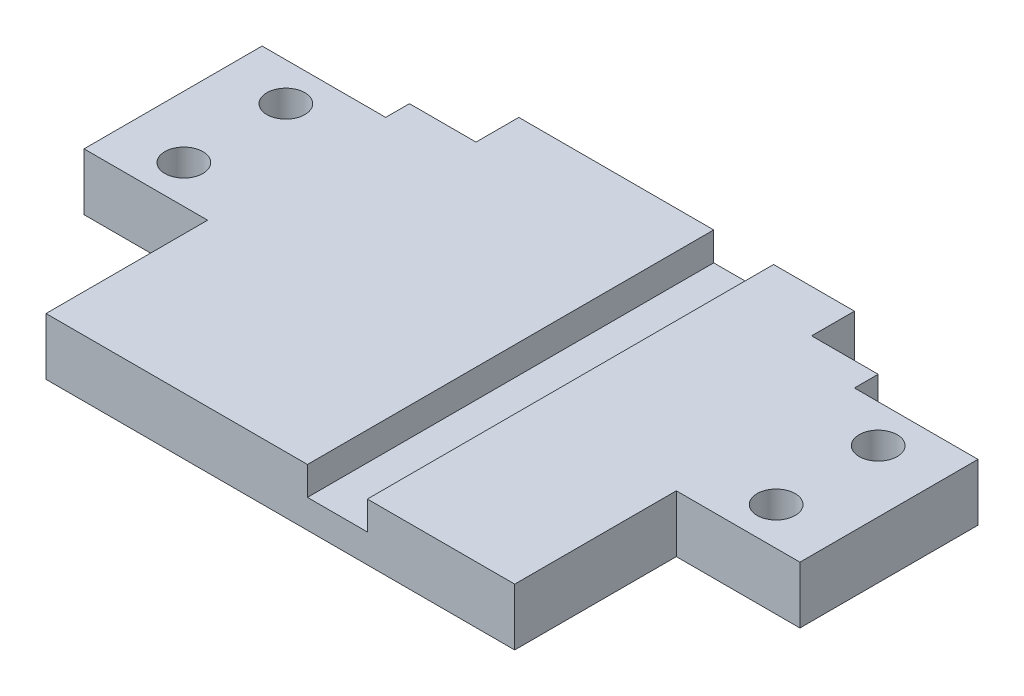
ISO-10303-21;
HEADER;
FILE_DESCRIPTION(('STEP AP214'),'2;1');
FILE_NAME('part.step','',(''),(''),'','','');
FILE_SCHEMA(('AUTOMOTIVE_DESIGN { 1 0 10303 214 1 1 1 1 }'));
ENDSEC;
DATA;
#1=APPLICATION_CONTEXT('core data for automotive mechanical design processes');
#2=APPLICATION_PROTOCOL_DEFINITION('international standard','automotive_design',2000,#1);
#3=PRODUCT_CONTEXT('',#1,'mechanical');
#4=PRODUCT('Part','Part','',(#3));
#5=PRODUCT_RELATED_PRODUCT_CATEGORY('part','',(#4));
#6=PRODUCT_DEFINITION_FORMATION('','',#4);
#7=PRODUCT_DEFINITION_CONTEXT('part definition',#1,'design');
#8=PRODUCT_DEFINITION('design','',#6,#7);
#9=PRODUCT_DEFINITION_SHAPE('','',#8);
#10=(LENGTH_UNIT() NAMED_UNIT(*) SI_UNIT(.MILLI.,.METRE.));
#11=(NAMED_UNIT(*) PLANE_ANGLE_UNIT() SI_UNIT($,.RADIAN.));
#12=(NAMED_UNIT(*) SI_UNIT($,.STERADIAN.) SOLID_ANGLE_UNIT());
#13=UNCERTAINTY_MEASURE_WITH_UNIT(LENGTH_MEASURE(1.E-05),#10,'distance_accuracy_value','');
#14=(GEOMETRIC_REPRESENTATION_CONTEXT(3) GLOBAL_UNCERTAINTY_ASSIGNED_CONTEXT((#13)) GLOBAL_UNIT_ASSIGNED_CONTEXT((#10,
#11,#12)) REPRESENTATION_CONTEXT('',''));
#15=CARTESIAN_POINT('',(0.,0.,0.));
#16=DIRECTION('',(0.,0.,1.));
#17=DIRECTION('',(1.,0.,0.));
#18=AXIS2_PLACEMENT_3D('',#15,#16,#17);
#19=CARTESIAN_POINT('',(-17.65,3.,-7.));
#20=DIRECTION('',(0.,1.,0.));
#21=DIRECTION('',(0.,0.,1.));
#22=AXIS2_PLACEMENT_3D('',#19,#20,#21);
#23=PLANE('',#22);
#24=DIRECTION('',(1.,0.,0.));
#25=VECTOR('',#24,1.);
#26=CARTESIAN_POINT('',(24.65,3.,-7.));
#27=LINE('',#26,#25);
#28=CARTESIAN_POINT('',(-17.65,3.,-7.));
#29=VERTEX_POINT('',#28);
#30=CARTESIAN_POINT('',(2.84999999999998,3.,-7.));
#31=VERTEX_POINT('',#30);
#32=EDGE_CURVE('E104',#29,#31,#27,.T.);
#33=ORIENTED_EDGE('',*,*,#32,.F.);
#34=DIRECTION('',(0.,0.,-1.));
#35=VECTOR('',#34,1.);
#36=CARTESIAN_POINT('',(-17.65,3.,-7.));
#37=LINE('',#36,#35);
#38=CARTESIAN_POINT('',(-17.65,3.,-2.5));
#39=VERTEX_POINT('',#38);
#40=EDGE_CURVE('E94',#39,#29,#37,.T.);
#41=ORIENTED_EDGE('',*,*,#40,.F.);
#42=DIRECTION('',(1.,0.,0.));
#43=VECTOR('',#42,1.);
#44=CARTESIAN_POINT('',(-24.65,3.,-2.5));
#45=LINE('',#44,#43);
#46=CARTESIAN_POINT('',(-24.65,3.,-2.5));
#47=VERTEX_POINT('',#46);
#48=EDGE_CURVE('E39',#47,#39,#45,.T.);
#49=ORIENTED_EDGE('',*,*,#48,.F.);
#50=DIRECTION('',(0.,0.,1.));
#51=VECTOR('',#50,1.);
#52=CARTESIAN_POINT('',(-24.65,3.,-7.));
#53=LINE('',#52,#51);
#54=CARTESIAN_POINT('',(-24.65,3.,0.));
#55=VERTEX_POINT('',#54);
#56=EDGE_CURVE('E92',#47,#55,#53,.T.);
#57=ORIENTED_EDGE('',*,*,#56,.T.);
#58=DIRECTION('',(-1.,0.,0.));
#59=VECTOR('',#58,1.);
#60=CARTESIAN_POINT('',(-37.65,3.,0.));
#61=LINE('',#60,#59);
#62=CARTESIAN_POINT('',(-37.65,3.,0.));
#63=VERTEX_POINT('',#62);
#64=EDGE_CURVE('E232',#55,#63,#61,.T.);
#65=ORIENTED_EDGE('',*,*,#64,.T.);
#66=DIRECTION('',(0.,0.,-1.));
#67=VECTOR('',#66,1.);
#68=CARTESIAN_POINT('',(-37.65,3.,18.73));
#69=LINE('',#68,#67);
#70=CARTESIAN_POINT('',(-37.65,3.,18.73));
#71=VERTEX_POINT('',#70);
#72=EDGE_CURVE('E248',#71,#63,#69,.T.);
#73=ORIENTED_EDGE('',*,*,#72,.F.);
#74=DIRECTION('',(-1.,0.,0.));
#75=VECTOR('',#74,1.);
#76=CARTESIAN_POINT('',(-37.65,3.,18.73));
#77=LINE('',#76,#75);
#78=CARTESIAN_POINT('',(-24.65,3.,18.73));
#79=VERTEX_POINT('',#78);
#80=EDGE_CURVE('E258',#79,#71,#77,.T.);
#81=ORIENTED_EDGE('',*,*,#80,.F.);
#82=DIRECTION('',(0.,0.,-1.));
#83=VECTOR('',#82,1.);
#84=CARTESIAN_POINT('',(-24.65,3.,35.73));
#85=LINE('',#84,#83);
#86=CARTESIAN_POINT('',(-24.65,3.,35.73));
#87=VERTEX_POINT('',#86);
#88=EDGE_CURVE('E300',#87,#79,#85,.T.);
#89=ORIENTED_EDGE('',*,*,#88,.F.);
#90=DIRECTION('',(-1.,0.,0.));
#91=VECTOR('',#90,1.);
#92=CARTESIAN_POINT('',(-24.65,3.,35.73));
#93=LINE('',#92,#91);
#94=CARTESIAN_POINT('',(2.84999999999998,3.,35.73));
#95=VERTEX_POINT('',#94);
#96=EDGE_CURVE('E176',#95,#87,#93,.T.);
#97=ORIENTED_EDGE('',*,*,#96,.F.);
#98=DIRECTION('',(0.,0.,-1.));
#99=VECTOR('',#98,1.);
#100=CARTESIAN_POINT('',(2.84999999999998,3.,0.));
#101=LINE('',#100,#99);
#102=EDGE_CURVE('E136',#95,#31,#101,.T.);
#103=ORIENTED_EDGE('',*,*,#102,.T.);
#104=EDGE_LOOP('',(#33,#41,#49,#57,#65,#73,#81,#89,#97,#103));
#105=FACE_BOUND('',#104,.T.);
#106=CARTESIAN_POINT('',(-31.15,3.,4.));
#107=DIRECTION('',(0.,1.,0.));
#108=DIRECTION('',(0.,0.,1.));
#109=AXIS2_PLACEMENT_3D('',#106,#107,#108);
#110=CIRCLE('',#109,2.);
#111=CARTESIAN_POINT('',(-31.15,3.,6.));
#112=VERTEX_POINT('',#111);
#113=EDGE_CURVE('E279',#112,#112,#110,.T.);
#114=ORIENTED_EDGE('',*,*,#113,.F.);
#115=EDGE_LOOP('',(#114));
#116=FACE_BOUND('',#115,.T.);
#117=CARTESIAN_POINT('',(-31.15,3.,14.73));
#118=DIRECTION('',(0.,1.,0.));
#119=DIRECTION('',(0.,0.,1.));
#120=AXIS2_PLACEMENT_3D('',#117,#118,#119);
#121=CIRCLE('',#120,2.);
#122=CARTESIAN_POINT('',(-31.15,3.,16.73));
#123=VERTEX_POINT('',#122);
#124=EDGE_CURVE('E282',#123,#123,#121,.T.);
#125=ORIENTED_EDGE('',*,*,#124,.F.);
#126=EDGE_LOOP('',(#125));
#127=FACE_BOUND('',#126,.T.);
#128=ADVANCED_FACE('F36',(#105,#116,#127),#23,.T.);
#129=CARTESIAN_POINT('',(-37.65,3.,18.73));
#130=DIRECTION('',(0.,-1.,0.));
#131=DIRECTION('',(0.,0.,-1.));
#132=AXIS2_PLACEMENT_3D('',#129,#130,#131);
#133=PLANE('',#132);
#134=CARTESIAN_POINT('',(31.15,3.,3.99999999999993));
#135=DIRECTION('',(0.,1.,0.));
#136=DIRECTION('',(0.,0.,-1.));
#137=AXIS2_PLACEMENT_3D('',#134,#135,#136);
#138=CIRCLE('',#137,2.);
#139=CARTESIAN_POINT('',(31.15,3.,5.99999999999993));
#140=VERTEX_POINT('',#139);
#141=EDGE_CURVE('E283',#140,#140,#138,.T.);
#142=ORIENTED_EDGE('',*,*,#141,.F.);
#143=EDGE_LOOP('',(#142));
#144=FACE_BOUND('',#143,.T.);
#145=CARTESIAN_POINT('',(31.15,3.,14.7299999999999));
#146=DIRECTION('',(0.,1.,0.));
#147=DIRECTION('',(0.,0.,-1.));
#148=AXIS2_PLACEMENT_3D('',#145,#146,#147);
#149=CIRCLE('',#148,2.);
#150=CARTESIAN_POINT('',(31.15,3.,16.7299999999999));
#151=VERTEX_POINT('',#150);
#152=EDGE_CURVE('E287',#151,#151,#149,.T.);
#153=ORIENTED_EDGE('',*,*,#152,.F.);
#154=EDGE_LOOP('',(#153));
#155=FACE_BOUND('',#154,.T.);
#156=DIRECTION('',(0.,0.,1.));
#157=VECTOR('',#156,1.);
#158=CARTESIAN_POINT('',(24.65,3.,-7.));
#159=LINE('',#158,#157);
#160=CARTESIAN_POINT('',(24.65,3.,-2.5));
#161=VERTEX_POINT('',#160);
#162=CARTESIAN_POINT('',(24.65,3.,0.));
#163=VERTEX_POINT('',#162);
#164=EDGE_CURVE('E100',#161,#163,#159,.T.);
#165=ORIENTED_EDGE('',*,*,#164,.F.);
#166=DIRECTION('',(1.,0.,0.));
#167=VECTOR('',#166,1.);
#168=CARTESIAN_POINT('',(24.65,3.,-2.5));
#169=LINE('',#168,#167);
#170=CARTESIAN_POINT('',(17.65,3.,-2.5));
#171=VERTEX_POINT('',#170);
#172=EDGE_CURVE('E156',#171,#161,#169,.T.);
#173=ORIENTED_EDGE('',*,*,#172,.F.);
#174=DIRECTION('',(0.,0.,1.));
#175=VECTOR('',#174,1.);
#176=CARTESIAN_POINT('',(17.65,3.,-7.));
#177=LINE('',#176,#175);
#178=CARTESIAN_POINT('',(17.65,3.,-7.));
#179=VERTEX_POINT('',#178);
#180=EDGE_CURVE('E95',#179,#171,#177,.T.);
#181=ORIENTED_EDGE('',*,*,#180,.F.);
#182=CARTESIAN_POINT('',(9.14999999999998,3.,-7.));
#183=VERTEX_POINT('',#182);
#184=EDGE_CURVE('E118',#183,#179,#27,.T.);
#185=ORIENTED_EDGE('',*,*,#184,.F.);
#186=DIRECTION('',(0.,0.,-1.));
#187=VECTOR('',#186,1.);
#188=CARTESIAN_POINT('',(9.14999999999998,3.,0.));
#189=LINE('',#188,#187);
#190=CARTESIAN_POINT('',(9.14999999999998,3.,35.73));
#191=VERTEX_POINT('',#190);
#192=EDGE_CURVE('E133',#191,#183,#189,.T.);
#193=ORIENTED_EDGE('',*,*,#192,.F.);
#194=CARTESIAN_POINT('',(24.65,3.,35.73));
#195=VERTEX_POINT('',#194);
#196=EDGE_CURVE('E303',#195,#191,#93,.T.);
#197=ORIENTED_EDGE('',*,*,#196,.F.);
#198=DIRECTION('',(0.,0.,-1.));
#199=VECTOR('',#198,1.);
#200=CARTESIAN_POINT('',(24.65,3.,35.73));
#201=LINE('',#200,#199);
#202=CARTESIAN_POINT('',(24.65,3.,18.73));
#203=VERTEX_POINT('',#202);
#204=EDGE_CURVE('E297',#195,#203,#201,.T.);
#205=ORIENTED_EDGE('',*,*,#204,.T.);
#206=CARTESIAN_POINT('',(37.65,3.,18.73));
#207=VERTEX_POINT('',#206);
#208=EDGE_CURVE('E255',#207,#203,#77,.T.);
#209=ORIENTED_EDGE('',*,*,#208,.F.);
#210=DIRECTION('',(0.,0.,-1.));
#211=VECTOR('',#210,1.);
#212=CARTESIAN_POINT('',(37.65,3.,18.73));
#213=LINE('',#212,#211);
#214=CARTESIAN_POINT('',(37.65,3.,0.));
#215=VERTEX_POINT('',#214);
#216=EDGE_CURVE('E391',#207,#215,#213,.T.);
#217=ORIENTED_EDGE('',*,*,#216,.T.);
#218=EDGE_CURVE('E241',#215,#163,#61,.T.);
#219=ORIENTED_EDGE('',*,*,#218,.T.);
#220=EDGE_LOOP('',(#165,#173,#181,#185,#193,#197,#205,#209,#217,#219));
#221=FACE_BOUND('',#220,.T.);
#222=ADVANCED_FACE('F340',(#144,#155,#221),#133,.F.);
#223=CARTESIAN_POINT('',(37.65,3.,18.73));
#224=DIRECTION('',(-1.,0.,0.));
#225=DIRECTION('',(0.,0.,1.));
#226=AXIS2_PLACEMENT_3D('',#223,#224,#225);
#227=PLANE('',#226);
#228=DIRECTION('',(0.,1.,0.));
#229=VECTOR('',#228,1.);
#230=CARTESIAN_POINT('',(37.65,3.,0.));
#231=LINE('',#230,#229);
#232=CARTESIAN_POINT('',(37.65,-3.,0.));
#233=VERTEX_POINT('',#232);
#234=EDGE_CURVE('E240',#233,#215,#231,.T.);
#235=ORIENTED_EDGE('',*,*,#234,.T.);
#236=ORIENTED_EDGE('',*,*,#216,.F.);
#237=DIRECTION('',(0.,1.,0.));
#238=VECTOR('',#237,1.);
#239=CARTESIAN_POINT('',(37.65,3.,18.73));
#240=LINE('',#239,#238);
#241=CARTESIAN_POINT('',(37.65,-3.,18.73));
#242=VERTEX_POINT('',#241);
#243=EDGE_CURVE('E259',#242,#207,#240,.T.);
#244=ORIENTED_EDGE('',*,*,#243,.F.);
#245=DIRECTION('',(0.,0.,-1.));
#246=VECTOR('',#245,1.);
#247=CARTESIAN_POINT('',(37.65,-3.,18.73));
#248=LINE('',#247,#246);
#249=EDGE_CURVE('E398',#242,#233,#248,.T.);
#250=ORIENTED_EDGE('',*,*,#249,.T.);
#251=EDGE_LOOP('',(#235,#236,#244,#250));
#252=FACE_BOUND('',#251,.T.);
#253=ADVANCED_FACE('F397',(#252),#227,.F.);
#254=CARTESIAN_POINT('',(0.,0.,0.));
#255=DIRECTION('',(0.,0.,1.));
#256=DIRECTION('',(1.,0.,0.));
#257=AXIS2_PLACEMENT_3D('',#254,#255,#256);
#258=PLANE('',#257);
#259=DIRECTION('',(0.,-1.,0.));
#260=VECTOR('',#259,1.);
#261=CARTESIAN_POINT('',(24.65,3.,0.));
#262=LINE('',#261,#260);
#263=CARTESIAN_POINT('',(24.65,-3.,0.));
#264=VERTEX_POINT('',#263);
#265=EDGE_CURVE('E111',#163,#264,#262,.T.);
#266=ORIENTED_EDGE('',*,*,#265,.F.);
#267=ORIENTED_EDGE('',*,*,#218,.F.);
#268=ORIENTED_EDGE('',*,*,#234,.F.);
#269=DIRECTION('',(1.,0.,0.));
#270=VECTOR('',#269,1.);
#271=CARTESIAN_POINT('',(-37.65,-3.,0.));
#272=LINE('',#271,#270);
#273=EDGE_CURVE('E252',#264,#233,#272,.T.);
#274=ORIENTED_EDGE('',*,*,#273,.F.);
#275=EDGE_LOOP('',(#266,#267,#268,#274));
#276=FACE_BOUND('',#275,.T.);
#277=ADVANCED_FACE('F332',(#276),#258,.F.);
#278=DIRECTION('',(0.,1.,0.));
#279=VECTOR('',#278,1.);
#280=CARTESIAN_POINT('',(-24.65,3.,0.));
#281=LINE('',#280,#279);
#282=CARTESIAN_POINT('',(-24.65,-3.,0.));
#283=VERTEX_POINT('',#282);
#284=EDGE_CURVE('E99',#283,#55,#281,.T.);
#285=ORIENTED_EDGE('',*,*,#284,.F.);
#286=CARTESIAN_POINT('',(-37.65,-3.,0.));
#287=VERTEX_POINT('',#286);
#288=EDGE_CURVE('E222',#287,#283,#272,.T.);
#289=ORIENTED_EDGE('',*,*,#288,.F.);
#290=DIRECTION('',(0.,-1.,0.));
#291=VECTOR('',#290,1.);
#292=CARTESIAN_POINT('',(-37.65,3.,0.));
#293=LINE('',#292,#291);
#294=EDGE_CURVE('E235',#63,#287,#293,.T.);
#295=ORIENTED_EDGE('',*,*,#294,.F.);
#296=ORIENTED_EDGE('',*,*,#64,.F.);
#297=EDGE_LOOP('',(#285,#289,#295,#296));
#298=FACE_BOUND('',#297,.T.);
#299=ADVANCED_FACE('F229',(#298),#258,.F.);
#300=CARTESIAN_POINT('',(0.,0.,35.73));
#301=DIRECTION('',(0.,0.,1.));
#302=DIRECTION('',(1.,0.,0.));
#303=AXIS2_PLACEMENT_3D('',#300,#301,#302);
#304=PLANE('',#303);
#305=DIRECTION('',(1.,0.,0.));
#306=VECTOR('',#305,1.);
#307=CARTESIAN_POINT('',(0.,0.,35.73));
#308=LINE('',#307,#306);
#309=CARTESIAN_POINT('',(2.84999999999998,0.,35.73));
#310=VERTEX_POINT('',#309);
#311=CARTESIAN_POINT('',(9.14999999999998,0.,35.73));
#312=VERTEX_POINT('',#311);
#313=EDGE_CURVE('E146',#310,#312,#308,.T.);
#314=ORIENTED_EDGE('',*,*,#313,.F.);
#315=DIRECTION('',(0.,1.,0.));
#316=VECTOR('',#315,1.);
#317=CARTESIAN_POINT('',(2.84999999999998,0.,35.73));
#318=LINE('',#317,#316);
#319=EDGE_CURVE('E121',#310,#95,#318,.T.);
#320=ORIENTED_EDGE('',*,*,#319,.T.);
#321=ORIENTED_EDGE('',*,*,#96,.T.);
#322=DIRECTION('',(0.,-1.,0.));
#323=VECTOR('',#322,1.);
#324=CARTESIAN_POINT('',(-24.65,3.,35.73));
#325=LINE('',#324,#323);
#326=CARTESIAN_POINT('',(-24.65,-3.,35.73));
#327=VERTEX_POINT('',#326);
#328=EDGE_CURVE('E308',#87,#327,#325,.T.);
#329=ORIENTED_EDGE('',*,*,#328,.T.);
#330=DIRECTION('',(1.,0.,0.));
#331=VECTOR('',#330,1.);
#332=CARTESIAN_POINT('',(-24.65,-3.,35.73));
#333=LINE('',#332,#331);
#334=CARTESIAN_POINT('',(24.65,-3.,35.73));
#335=VERTEX_POINT('',#334);
#336=EDGE_CURVE('E315',#327,#335,#333,.T.);
#337=ORIENTED_EDGE('',*,*,#336,.T.);
#338=DIRECTION('',(0.,1.,0.));
#339=VECTOR('',#338,1.);
#340=CARTESIAN_POINT('',(24.65,3.,35.73));
#341=LINE('',#340,#339);
#342=EDGE_CURVE('E312',#335,#195,#341,.T.);
#343=ORIENTED_EDGE('',*,*,#342,.T.);
#344=ORIENTED_EDGE('',*,*,#196,.T.);
#345=DIRECTION('',(0.,1.,0.));
#346=VECTOR('',#345,1.);
#347=CARTESIAN_POINT('',(9.14999999999998,0.,35.73));
#348=LINE('',#347,#346);
#349=EDGE_CURVE('E125',#312,#191,#348,.T.);
#350=ORIENTED_EDGE('',*,*,#349,.F.);
#351=EDGE_LOOP('',(#314,#320,#321,#329,#337,#343,#344,#350));
#352=FACE_BOUND('',#351,.T.);
#353=ADVANCED_FACE('F189',(#352),#304,.T.);
#354=CARTESIAN_POINT('',(0.,0.,0.));
#355=DIRECTION('',(0.,1.,0.));
#356=DIRECTION('',(0.,0.,1.));
#357=AXIS2_PLACEMENT_3D('',#354,#355,#356);
#358=PLANE('',#357);
#359=DIRECTION('',(0.,0.,-1.));
#360=VECTOR('',#359,1.);
#361=CARTESIAN_POINT('',(2.84999999999998,0.,0.));
#362=LINE('',#361,#360);
#363=CARTESIAN_POINT('',(2.84999999999998,0.,-7.));
#364=VERTEX_POINT('',#363);
#365=EDGE_CURVE('E137',#310,#364,#362,.T.);
#366=ORIENTED_EDGE('',*,*,#365,.F.);
#367=ORIENTED_EDGE('',*,*,#313,.T.);
#368=DIRECTION('',(0.,0.,-1.));
#369=VECTOR('',#368,1.);
#370=CARTESIAN_POINT('',(9.14999999999998,0.,0.));
#371=LINE('',#370,#369);
#372=CARTESIAN_POINT('',(9.14999999999998,0.,-7.));
#373=VERTEX_POINT('',#372);
#374=EDGE_CURVE('E143',#312,#373,#371,.T.);
#375=ORIENTED_EDGE('',*,*,#374,.T.);
#376=DIRECTION('',(-1.,0.,0.));
#377=VECTOR('',#376,1.);
#378=CARTESIAN_POINT('',(0.,0.,-7.));
#379=LINE('',#378,#377);
#380=EDGE_CURVE('E124',#373,#364,#379,.T.);
#381=ORIENTED_EDGE('',*,*,#380,.T.);
#382=EDGE_LOOP('',(#366,#367,#375,#381));
#383=FACE_BOUND('',#382,.T.);
#384=ADVANCED_FACE('F197',(#383),#358,.T.);
#385=CARTESIAN_POINT('',(0.,0.,-7.));
#386=DIRECTION('',(0.,0.,-1.));
#387=DIRECTION('',(-1.,0.,0.));
#388=AXIS2_PLACEMENT_3D('',#385,#386,#387);
#389=PLANE('',#388);
#390=DIRECTION('',(0.,1.,0.));
#391=VECTOR('',#390,1.);
#392=CARTESIAN_POINT('',(-17.65,-7.,-7.));
#393=LINE('',#392,#391);
#394=CARTESIAN_POINT('',(-17.65,-3.,-7.));
#395=VERTEX_POINT('',#394);
#396=EDGE_CURVE('E154',#395,#29,#393,.T.);
#397=ORIENTED_EDGE('',*,*,#396,.T.);
#398=ORIENTED_EDGE('',*,*,#32,.T.);
#399=DIRECTION('',(0.,1.,0.));
#400=VECTOR('',#399,1.);
#401=CARTESIAN_POINT('',(2.84999999999998,0.,-7.));
#402=LINE('',#401,#400);
#403=EDGE_CURVE('E115',#364,#31,#402,.T.);
#404=ORIENTED_EDGE('',*,*,#403,.F.);
#405=ORIENTED_EDGE('',*,*,#380,.F.);
#406=DIRECTION('',(0.,1.,0.));
#407=VECTOR('',#406,1.);
#408=CARTESIAN_POINT('',(9.14999999999998,0.,-7.));
#409=LINE('',#408,#407);
#410=EDGE_CURVE('E128',#373,#183,#409,.T.);
#411=ORIENTED_EDGE('',*,*,#410,.T.);
#412=ORIENTED_EDGE('',*,*,#184,.T.);
#413=DIRECTION('',(0.,1.,0.));
#414=VECTOR('',#413,1.);
#415=CARTESIAN_POINT('',(17.65,-7.,-7.));
#416=LINE('',#415,#414);
#417=CARTESIAN_POINT('',(17.65,-3.,-7.));
#418=VERTEX_POINT('',#417);
#419=EDGE_CURVE('E45',#418,#179,#416,.T.);
#420=ORIENTED_EDGE('',*,*,#419,.F.);
#421=DIRECTION('',(-1.,0.,0.));
#422=VECTOR('',#421,1.);
#423=CARTESIAN_POINT('',(24.65,-3.,-7.));
#424=LINE('',#423,#422);
#425=EDGE_CURVE('E112',#418,#395,#424,.T.);
#426=ORIENTED_EDGE('',*,*,#425,.T.);
#427=EDGE_LOOP('',(#397,#398,#404,#405,#411,#412,#420,#426));
#428=FACE_BOUND('',#427,.T.);
#429=ADVANCED_FACE('F166',(#428),#389,.T.);
#430=CARTESIAN_POINT('',(-37.65,-3.,18.73));
#431=DIRECTION('',(0.,1.,0.));
#432=DIRECTION('',(0.,0.,1.));
#433=AXIS2_PLACEMENT_3D('',#430,#431,#432);
#434=PLANE('',#433);
#435=CARTESIAN_POINT('',(31.15,-3.,3.99999999999993));
#436=DIRECTION('',(0.,1.,0.));
#437=DIRECTION('',(0.,0.,1.));
#438=AXIS2_PLACEMENT_3D('',#435,#436,#437);
#439=CIRCLE('',#438,2.);
#440=CARTESIAN_POINT('',(31.15,-3.,5.99999999999993));
#441=VERTEX_POINT('',#440);
#442=EDGE_CURVE('E254',#441,#441,#439,.T.);
#443=ORIENTED_EDGE('',*,*,#442,.T.);
#444=EDGE_LOOP('',(#443));
#445=FACE_BOUND('',#444,.T.);
#446=CARTESIAN_POINT('',(31.15,-3.,14.7299999999999));
#447=DIRECTION('',(0.,1.,0.));
#448=DIRECTION('',(0.,0.,1.));
#449=AXIS2_PLACEMENT_3D('',#446,#447,#448);
#450=CIRCLE('',#449,2.);
#451=CARTESIAN_POINT('',(31.15,-3.,16.7299999999999));
#452=VERTEX_POINT('',#451);
#453=EDGE_CURVE('E270',#452,#452,#450,.T.);
#454=ORIENTED_EDGE('',*,*,#453,.T.);
#455=EDGE_LOOP('',(#454));
#456=FACE_BOUND('',#455,.T.);
#457=CARTESIAN_POINT('',(-31.15,-3.,14.73));
#458=DIRECTION('',(0.,1.,0.));
#459=DIRECTION('',(0.,0.,1.));
#460=AXIS2_PLACEMENT_3D('',#457,#458,#459);
#461=CIRCLE('',#460,2.);
#462=CARTESIAN_POINT('',(-31.15,-3.,16.73));
#463=VERTEX_POINT('',#462);
#464=EDGE_CURVE('E273',#463,#463,#461,.T.);
#465=ORIENTED_EDGE('',*,*,#464,.T.);
#466=EDGE_LOOP('',(#465));
#467=FACE_BOUND('',#466,.T.);
#468=CARTESIAN_POINT('',(-31.15,-3.,4.));
#469=DIRECTION('',(0.,1.,0.));
#470=DIRECTION('',(0.,0.,1.));
#471=AXIS2_PLACEMENT_3D('',#468,#469,#470);
#472=CIRCLE('',#471,2.);
#473=CARTESIAN_POINT('',(-31.15,-3.,6.));
#474=VERTEX_POINT('',#473);
#475=EDGE_CURVE('E276',#474,#474,#472,.T.);
#476=ORIENTED_EDGE('',*,*,#475,.T.);
#477=EDGE_LOOP('',(#476));
#478=FACE_BOUND('',#477,.T.);
#479=DIRECTION('',(1.,0.,0.));
#480=VECTOR('',#479,1.);
#481=CARTESIAN_POINT('',(-37.65,-3.,-2.5));
#482=LINE('',#481,#480);
#483=CARTESIAN_POINT('',(-24.65,-3.,-2.5));
#484=VERTEX_POINT('',#483);
#485=CARTESIAN_POINT('',(-17.65,-3.,-2.5));
#486=VERTEX_POINT('',#485);
#487=EDGE_CURVE('E78',#484,#486,#482,.T.);
#488=ORIENTED_EDGE('',*,*,#487,.T.);
#489=DIRECTION('',(0.,0.,-1.));
#490=VECTOR('',#489,1.);
#491=CARTESIAN_POINT('',(-17.65,-3.,18.73));
#492=LINE('',#491,#490);
#493=EDGE_CURVE('E213',#486,#395,#492,.T.);
#494=ORIENTED_EDGE('',*,*,#493,.T.);
#495=ORIENTED_EDGE('',*,*,#425,.F.);
#496=DIRECTION('',(0.,0.,1.));
#497=VECTOR('',#496,1.);
#498=CARTESIAN_POINT('',(17.65,-3.,18.73));
#499=LINE('',#498,#497);
#500=CARTESIAN_POINT('',(17.65,-3.,-2.5));
#501=VERTEX_POINT('',#500);
#502=EDGE_CURVE('E215',#418,#501,#499,.T.);
#503=ORIENTED_EDGE('',*,*,#502,.T.);
#504=DIRECTION('',(1.,0.,0.));
#505=VECTOR('',#504,1.);
#506=CARTESIAN_POINT('',(-37.65,-3.,-2.49999999999999));
#507=LINE('',#506,#505);
#508=CARTESIAN_POINT('',(24.65,-3.,-2.5));
#509=VERTEX_POINT('',#508);
#510=EDGE_CURVE('E140',#501,#509,#507,.T.);
#511=ORIENTED_EDGE('',*,*,#510,.T.);
#512=DIRECTION('',(0.,0.,1.));
#513=VECTOR('',#512,1.);
#514=CARTESIAN_POINT('',(24.65,-3.,-7.));
#515=LINE('',#514,#513);
#516=EDGE_CURVE('E106',#509,#264,#515,.T.);
#517=ORIENTED_EDGE('',*,*,#516,.T.);
#518=ORIENTED_EDGE('',*,*,#273,.T.);
#519=ORIENTED_EDGE('',*,*,#249,.F.);
#520=DIRECTION('',(1.,0.,0.));
#521=VECTOR('',#520,1.);
#522=CARTESIAN_POINT('',(-37.65,-3.,18.73));
#523=LINE('',#522,#521);
#524=CARTESIAN_POINT('',(24.65,-3.,18.73));
#525=VERTEX_POINT('',#524);
#526=EDGE_CURVE('E265',#525,#242,#523,.T.);
#527=ORIENTED_EDGE('',*,*,#526,.F.);
#528=DIRECTION('',(0.,0.,-1.));
#529=VECTOR('',#528,1.);
#530=CARTESIAN_POINT('',(24.65,-3.,35.73));
#531=LINE('',#530,#529);
#532=EDGE_CURVE('E294',#335,#525,#531,.T.);
#533=ORIENTED_EDGE('',*,*,#532,.F.);
#534=ORIENTED_EDGE('',*,*,#336,.F.);
#535=DIRECTION('',(0.,0.,-1.));
#536=VECTOR('',#535,1.);
#537=CARTESIAN_POINT('',(-24.65,-3.,35.73));
#538=LINE('',#537,#536);
#539=CARTESIAN_POINT('',(-24.65,-3.,18.73));
#540=VERTEX_POINT('',#539);
#541=EDGE_CURVE('E286',#327,#540,#538,.T.);
#542=ORIENTED_EDGE('',*,*,#541,.T.);
#543=CARTESIAN_POINT('',(-37.65,-3.,18.73));
#544=VERTEX_POINT('',#543);
#545=EDGE_CURVE('E262',#544,#540,#523,.T.);
#546=ORIENTED_EDGE('',*,*,#545,.F.);
#547=DIRECTION('',(0.,0.,-1.));
#548=VECTOR('',#547,1.);
#549=CARTESIAN_POINT('',(-37.65,-3.,18.73));
#550=LINE('',#549,#548);
#551=EDGE_CURVE('E83',#544,#287,#550,.T.);
#552=ORIENTED_EDGE('',*,*,#551,.T.);
#553=ORIENTED_EDGE('',*,*,#288,.T.);
#554=DIRECTION('',(0.,0.,1.));
#555=VECTOR('',#554,1.);
#556=CARTESIAN_POINT('',(-24.65,-3.,-7.));
#557=LINE('',#556,#555);
#558=EDGE_CURVE('E101',#484,#283,#557,.T.);
#559=ORIENTED_EDGE('',*,*,#558,.F.);
#560=EDGE_LOOP('',(#488,#494,#495,#503,#511,#517,#518,#519,#527,#533,#534,#542,#546,#552,#553,#559));
#561=FACE_BOUND('',#560,.T.);
#562=ADVANCED_FACE('F217',(#445,#456,#467,#478,#561),#434,.F.);
#563=CARTESIAN_POINT('',(24.65,3.,-7.));
#564=DIRECTION('',(-1.,0.,0.));
#565=DIRECTION('',(0.,0.,1.));
#566=AXIS2_PLACEMENT_3D('',#563,#564,#565);
#567=PLANE('',#566);
#568=ORIENTED_EDGE('',*,*,#516,.F.);
#569=DIRECTION('',(0.,1.,0.));
#570=VECTOR('',#569,1.);
#571=CARTESIAN_POINT('',(24.65,3.,-2.5));
#572=LINE('',#571,#570);
#573=EDGE_CURVE('E84',#509,#161,#572,.T.);
#574=ORIENTED_EDGE('',*,*,#573,.T.);
#575=ORIENTED_EDGE('',*,*,#164,.T.);
#576=ORIENTED_EDGE('',*,*,#265,.T.);
#577=EDGE_LOOP('',(#568,#574,#575,#576));
#578=FACE_BOUND('',#577,.T.);
#579=ADVANCED_FACE('F334',(#578),#567,.F.);
#580=CARTESIAN_POINT('',(17.65,-7.,-7.));
#581=DIRECTION('',(-1.,0.,0.));
#582=DIRECTION('',(0.,0.,1.));
#583=AXIS2_PLACEMENT_3D('',#580,#581,#582);
#584=PLANE('',#583);
#585=ORIENTED_EDGE('',*,*,#419,.T.);
#586=ORIENTED_EDGE('',*,*,#180,.T.);
#587=DIRECTION('',(0.,1.,0.));
#588=VECTOR('',#587,1.);
#589=CARTESIAN_POINT('',(17.65,-7.,-2.5));
#590=LINE('',#589,#588);
#591=EDGE_CURVE('E11',#501,#171,#590,.T.);
#592=ORIENTED_EDGE('',*,*,#591,.F.);
#593=ORIENTED_EDGE('',*,*,#502,.F.);
#594=EDGE_LOOP('',(#585,#586,#592,#593));
#595=FACE_BOUND('',#594,.T.);
#596=ADVANCED_FACE('F404',(#595),#584,.F.);
#597=CARTESIAN_POINT('',(24.65,-7.,-2.5));
#598=DIRECTION('',(0.,0.,1.));
#599=DIRECTION('',(1.,0.,0.));
#600=AXIS2_PLACEMENT_3D('',#597,#598,#599);
#601=PLANE('',#600);
#602=ORIENTED_EDGE('',*,*,#591,.T.);
#603=ORIENTED_EDGE('',*,*,#172,.T.);
#604=ORIENTED_EDGE('',*,*,#573,.F.);
#605=ORIENTED_EDGE('',*,*,#510,.F.);
#606=EDGE_LOOP('',(#602,#603,#604,#605));
#607=FACE_BOUND('',#606,.T.);
#608=ADVANCED_FACE('F407',(#607),#601,.F.);
#609=CARTESIAN_POINT('',(-17.65,-7.,-7.));
#610=DIRECTION('',(1.,0.,0.));
#611=DIRECTION('',(0.,0.,-1.));
#612=AXIS2_PLACEMENT_3D('',#609,#610,#611);
#613=PLANE('',#612);
#614=DIRECTION('',(0.,1.,0.));
#615=VECTOR('',#614,1.);
#616=CARTESIAN_POINT('',(-17.65,-7.,-2.5));
#617=LINE('',#616,#615);
#618=EDGE_CURVE('E66',#486,#39,#617,.T.);
#619=ORIENTED_EDGE('',*,*,#618,.T.);
#620=ORIENTED_EDGE('',*,*,#40,.T.);
#621=ORIENTED_EDGE('',*,*,#396,.F.);
#622=ORIENTED_EDGE('',*,*,#493,.F.);
#623=EDGE_LOOP('',(#619,#620,#621,#622));
#624=FACE_BOUND('',#623,.T.);
#625=ADVANCED_FACE('F162',(#624),#613,.F.);
#626=CARTESIAN_POINT('',(-24.65,3.,-7.));
#627=DIRECTION('',(1.,0.,0.));
#628=DIRECTION('',(0.,0.,-1.));
#629=AXIS2_PLACEMENT_3D('',#626,#627,#628);
#630=PLANE('',#629);
#631=ORIENTED_EDGE('',*,*,#56,.F.);
#632=DIRECTION('',(0.,-1.,0.));
#633=VECTOR('',#632,1.);
#634=CARTESIAN_POINT('',(-24.65,3.,-2.5));
#635=LINE('',#634,#633);
#636=EDGE_CURVE('E72',#47,#484,#635,.T.);
#637=ORIENTED_EDGE('',*,*,#636,.T.);
#638=ORIENTED_EDGE('',*,*,#558,.T.);
#639=ORIENTED_EDGE('',*,*,#284,.T.);
#640=EDGE_LOOP('',(#631,#637,#638,#639));
#641=FACE_BOUND('',#640,.T.);
#642=ADVANCED_FACE('F97',(#641),#630,.F.);
#643=CARTESIAN_POINT('',(-24.65,-7.,-2.5));
#644=DIRECTION('',(0.,0.,1.));
#645=DIRECTION('',(1.,0.,0.));
#646=AXIS2_PLACEMENT_3D('',#643,#644,#645);
#647=PLANE('',#646);
#648=ORIENTED_EDGE('',*,*,#636,.F.);
#649=ORIENTED_EDGE('',*,*,#48,.T.);
#650=ORIENTED_EDGE('',*,*,#618,.F.);
#651=ORIENTED_EDGE('',*,*,#487,.F.);
#652=EDGE_LOOP('',(#648,#649,#650,#651));
#653=FACE_BOUND('',#652,.T.);
#654=ADVANCED_FACE('F74',(#653),#647,.F.);
#655=CARTESIAN_POINT('',(9.14999999999998,0.,0.));
#656=DIRECTION('',(1.,0.,0.));
#657=DIRECTION('',(0.,0.,-1.));
#658=AXIS2_PLACEMENT_3D('',#655,#656,#657);
#659=PLANE('',#658);
#660=ORIENTED_EDGE('',*,*,#192,.T.);
#661=ORIENTED_EDGE('',*,*,#410,.F.);
#662=ORIENTED_EDGE('',*,*,#374,.F.);
#663=ORIENTED_EDGE('',*,*,#349,.T.);
#664=EDGE_LOOP('',(#660,#661,#662,#663));
#665=FACE_BOUND('',#664,.T.);
#666=ADVANCED_FACE('F380',(#665),#659,.F.);
#667=CARTESIAN_POINT('',(2.84999999999998,0.,0.));
#668=DIRECTION('',(1.,0.,0.));
#669=DIRECTION('',(0.,0.,-1.));
#670=AXIS2_PLACEMENT_3D('',#667,#668,#669);
#671=PLANE('',#670);
#672=ORIENTED_EDGE('',*,*,#102,.F.);
#673=ORIENTED_EDGE('',*,*,#319,.F.);
#674=ORIENTED_EDGE('',*,*,#365,.T.);
#675=ORIENTED_EDGE('',*,*,#403,.T.);
#676=EDGE_LOOP('',(#672,#673,#674,#675));
#677=FACE_BOUND('',#676,.T.);
#678=ADVANCED_FACE('F182',(#677),#671,.T.);
#679=CARTESIAN_POINT('',(0.,0.,18.73));
#680=DIRECTION('',(0.,0.,1.));
#681=DIRECTION('',(1.,0.,0.));
#682=AXIS2_PLACEMENT_3D('',#679,#680,#681);
#683=PLANE('',#682);
#684=DIRECTION('',(0.,1.,0.));
#685=VECTOR('',#684,1.);
#686=CARTESIAN_POINT('',(24.65,3.,18.73));
#687=LINE('',#686,#685);
#688=EDGE_CURVE('E304',#525,#203,#687,.T.);
#689=ORIENTED_EDGE('',*,*,#688,.F.);
#690=ORIENTED_EDGE('',*,*,#526,.T.);
#691=ORIENTED_EDGE('',*,*,#243,.T.);
#692=ORIENTED_EDGE('',*,*,#208,.T.);
#693=EDGE_LOOP('',(#689,#690,#691,#692));
#694=FACE_BOUND('',#693,.T.);
#695=ADVANCED_FACE('F393',(#694),#683,.T.);
#696=CARTESIAN_POINT('',(24.65,3.,35.73));
#697=DIRECTION('',(-1.,0.,0.));
#698=DIRECTION('',(0.,0.,1.));
#699=AXIS2_PLACEMENT_3D('',#696,#697,#698);
#700=PLANE('',#699);
#701=ORIENTED_EDGE('',*,*,#688,.T.);
#702=ORIENTED_EDGE('',*,*,#204,.F.);
#703=ORIENTED_EDGE('',*,*,#342,.F.);
#704=ORIENTED_EDGE('',*,*,#532,.T.);
#705=EDGE_LOOP('',(#701,#702,#703,#704));
#706=FACE_BOUND('',#705,.T.);
#707=ADVANCED_FACE('F388',(#706),#700,.F.);
#708=DIRECTION('',(0.,-1.,0.));
#709=VECTOR('',#708,1.);
#710=CARTESIAN_POINT('',(-24.65,3.,18.73));
#711=LINE('',#710,#709);
#712=EDGE_CURVE('E307',#79,#540,#711,.T.);
#713=ORIENTED_EDGE('',*,*,#712,.F.);
#714=ORIENTED_EDGE('',*,*,#80,.T.);
#715=DIRECTION('',(0.,-1.,0.));
#716=VECTOR('',#715,1.);
#717=CARTESIAN_POINT('',(-37.65,3.,18.73));
#718=LINE('',#717,#716);
#719=EDGE_CURVE('E246',#71,#544,#718,.T.);
#720=ORIENTED_EDGE('',*,*,#719,.T.);
#721=ORIENTED_EDGE('',*,*,#545,.T.);
#722=EDGE_LOOP('',(#713,#714,#720,#721));
#723=FACE_BOUND('',#722,.T.);
#724=ADVANCED_FACE('F431',(#723),#683,.T.);
#725=CARTESIAN_POINT('',(-24.65,3.,35.73));
#726=DIRECTION('',(1.,0.,0.));
#727=DIRECTION('',(0.,0.,-1.));
#728=AXIS2_PLACEMENT_3D('',#725,#726,#727);
#729=PLANE('',#728);
#730=ORIENTED_EDGE('',*,*,#712,.T.);
#731=ORIENTED_EDGE('',*,*,#541,.F.);
#732=ORIENTED_EDGE('',*,*,#328,.F.);
#733=ORIENTED_EDGE('',*,*,#88,.T.);
#734=EDGE_LOOP('',(#730,#731,#732,#733));
#735=FACE_BOUND('',#734,.T.);
#736=ADVANCED_FACE('F441',(#735),#729,.F.);
#737=CARTESIAN_POINT('',(31.15,-10.73,3.99999999999993));
#738=DIRECTION('',(0.,1.,0.));
#739=DIRECTION('',(0.,0.,1.));
#740=AXIS2_PLACEMENT_3D('',#737,#738,#739);
#741=CYLINDRICAL_SURFACE('',#740,2.);
#742=CARTESIAN_POINT('',(31.15,3.,5.99999999999993));
#743=CARTESIAN_POINT('',(31.15,2.9375,5.99999999999993));
#744=CARTESIAN_POINT('',(31.15,2.875,5.99999999999993));
#745=CARTESIAN_POINT('',(31.15,2.75,5.99999999999993));
#746=CARTESIAN_POINT('',(31.15,2.6875,5.99999999999993));
#747=CARTESIAN_POINT('',(31.15,2.5625,5.99999999999993));
#748=CARTESIAN_POINT('',(31.15,2.5,5.99999999999993));
#749=CARTESIAN_POINT('',(31.15,2.375,5.99999999999993));
#750=CARTESIAN_POINT('',(31.15,2.3125,5.99999999999993));
#751=CARTESIAN_POINT('',(31.15,2.1875,5.99999999999993));
#752=CARTESIAN_POINT('',(31.15,2.125,5.99999999999993));
#753=CARTESIAN_POINT('',(31.15,2.,5.99999999999993));
#754=CARTESIAN_POINT('',(31.15,1.9375,5.99999999999993));
#755=CARTESIAN_POINT('',(31.15,1.8125,5.99999999999993));
#756=CARTESIAN_POINT('',(31.15,1.75,5.99999999999993));
#757=CARTESIAN_POINT('',(31.15,1.625,5.99999999999993));
#758=CARTESIAN_POINT('',(31.15,1.5625,5.99999999999993));
#759=CARTESIAN_POINT('',(31.15,1.4375,5.99999999999993));
#760=CARTESIAN_POINT('',(31.15,1.375,5.99999999999993));
#761=CARTESIAN_POINT('',(31.15,1.25,5.99999999999993));
#762=CARTESIAN_POINT('',(31.15,1.1875,5.99999999999993));
#763=CARTESIAN_POINT('',(31.15,1.0625,5.99999999999993));
#764=CARTESIAN_POINT('',(31.15,0.999999999999997,5.99999999999993));
#765=CARTESIAN_POINT('',(31.15,0.874999999999997,5.99999999999993));
#766=CARTESIAN_POINT('',(31.15,0.812499999999997,5.99999999999993));
#767=CARTESIAN_POINT('',(31.15,0.687499999999997,5.99999999999993));
#768=CARTESIAN_POINT('',(31.15,0.624999999999997,5.99999999999993));
#769=CARTESIAN_POINT('',(31.15,0.499999999999997,5.99999999999993));
#770=CARTESIAN_POINT('',(31.15,0.437499999999997,5.99999999999993));
#771=CARTESIAN_POINT('',(31.15,0.312499999999997,5.99999999999993));
#772=CARTESIAN_POINT('',(31.15,0.249999999999997,5.99999999999993));
#773=CARTESIAN_POINT('',(31.15,0.124999999999997,5.99999999999993));
#774=CARTESIAN_POINT('',(31.15,0.0624999999999966,5.99999999999993));
#775=CARTESIAN_POINT('',(31.15,-0.0625000000000035,5.99999999999993));
#776=CARTESIAN_POINT('',(31.15,-0.125000000000004,5.99999999999993));
#777=CARTESIAN_POINT('',(31.15,-0.250000000000004,5.99999999999993));
#778=CARTESIAN_POINT('',(31.15,-0.312500000000004,5.99999999999993));
#779=CARTESIAN_POINT('',(31.15,-0.437500000000004,5.99999999999993));
#780=CARTESIAN_POINT('',(31.15,-0.500000000000004,5.99999999999993));
#781=CARTESIAN_POINT('',(31.15,-0.625000000000004,5.99999999999993));
#782=CARTESIAN_POINT('',(31.15,-0.687500000000004,5.99999999999993));
#783=CARTESIAN_POINT('',(31.15,-0.812500000000004,5.99999999999993));
#784=CARTESIAN_POINT('',(31.15,-0.875000000000003,5.99999999999993));
#785=CARTESIAN_POINT('',(31.15,-1.,5.99999999999993));
#786=CARTESIAN_POINT('',(31.15,-1.0625,5.99999999999993));
#787=CARTESIAN_POINT('',(31.15,-1.1875,5.99999999999993));
#788=CARTESIAN_POINT('',(31.15,-1.25,5.99999999999993));
#789=CARTESIAN_POINT('',(31.15,-1.375,5.99999999999993));
#790=CARTESIAN_POINT('',(31.15,-1.4375,5.99999999999993));
#791=CARTESIAN_POINT('',(31.15,-1.5625,5.99999999999993));
#792=CARTESIAN_POINT('',(31.15,-1.625,5.99999999999993));
#793=CARTESIAN_POINT('',(31.15,-1.75,5.99999999999993));
#794=CARTESIAN_POINT('',(31.15,-1.8125,5.99999999999993));
#795=CARTESIAN_POINT('',(31.15,-1.9375,5.99999999999993));
#796=CARTESIAN_POINT('',(31.15,-2.,5.99999999999993));
#797=CARTESIAN_POINT('',(31.15,-2.125,5.99999999999993));
#798=CARTESIAN_POINT('',(31.15,-2.1875,5.99999999999993));
#799=CARTESIAN_POINT('',(31.15,-2.3125,5.99999999999993));
#800=CARTESIAN_POINT('',(31.15,-2.375,5.99999999999993));
#801=CARTESIAN_POINT('',(31.15,-2.5,5.99999999999993));
#802=CARTESIAN_POINT('',(31.15,-2.5625,5.99999999999993));
#803=CARTESIAN_POINT('',(31.15,-2.6875,5.99999999999993));
#804=CARTESIAN_POINT('',(31.15,-2.75,5.99999999999993));
#805=CARTESIAN_POINT('',(31.15,-2.875,5.99999999999993));
#806=CARTESIAN_POINT('',(31.15,-2.9375,5.99999999999993));
#807=CARTESIAN_POINT('',(31.15,-3.,5.99999999999993));
#808=B_SPLINE_CURVE_WITH_KNOTS('',3,(#742,#743,#744,#745,#746,#747,#748,#749,#750,#751,#752,
#753,#754,#755,#756,#757,#758,#759,#760,#761,#762,#763,#764,#765,#766,#767,#768,#769,#770,#771,
#772,#773,#774,#775,#776,#777,#778,#779,#780,#781,#782,#783,#784,#785,#786,#787,#788,#789,#790,
#791,#792,#793,#794,#795,#796,#797,#798,#799,#800,#801,#802,#803,#804,#805,#806,#807),
.UNSPECIFIED.,.F.,.F.,(4,2,2,2,2,2,2,2,2,2,2,2,2,2,2,2,2,2,2,2,2,2,2,2,2,2,2,2,2,2,2,2,4),(0.,
0.1875,0.375,0.5625,0.750000000000001,0.937500000000001,1.125,1.3125,1.5,1.6875,1.875,2.0625,
2.25,2.4375,2.625,2.8125,3.,3.1875,3.375,3.5625,3.75,3.9375,4.125,4.3125,4.5,4.6875,4.875,
5.0625,5.25,5.4375,5.625,5.8125,6.),.UNSPECIFIED.);
#809=EDGE_CURVE('BSEAM437',#140,#441,#808,.T.);
#810=ORIENTED_EDGE('',*,*,#141,.T.);
#811=ORIENTED_EDGE('',*,*,#442,.F.);
#812=ORIENTED_EDGE('',*,*,#809,.T.);
#813=ORIENTED_EDGE('',*,*,#809,.F.);
#814=EDGE_LOOP('',(#810,#812,#811,#813));
#815=FACE_BOUND('',#814,.T.);
#816=ADVANCED_FACE('F437',(#815),#741,.F.);
#817=CARTESIAN_POINT('',(31.15,-10.73,14.7299999999999));
#818=DIRECTION('',(0.,1.,0.));
#819=DIRECTION('',(0.,0.,1.));
#820=AXIS2_PLACEMENT_3D('',#817,#818,#819);
#821=CYLINDRICAL_SURFACE('',#820,2.);
#822=CARTESIAN_POINT('',(31.15,3.,16.7299999999999));
#823=CARTESIAN_POINT('',(31.15,2.9375,16.7299999999999));
#824=CARTESIAN_POINT('',(31.15,2.875,16.7299999999999));
#825=CARTESIAN_POINT('',(31.15,2.75,16.7299999999999));
#826=CARTESIAN_POINT('',(31.15,2.6875,16.7299999999999));
#827=CARTESIAN_POINT('',(31.15,2.5625,16.7299999999999));
#828=CARTESIAN_POINT('',(31.15,2.5,16.7299999999999));
#829=CARTESIAN_POINT('',(31.15,2.375,16.7299999999999));
#830=CARTESIAN_POINT('',(31.15,2.3125,16.7299999999999));
#831=CARTESIAN_POINT('',(31.15,2.1875,16.7299999999999));
#832=CARTESIAN_POINT('',(31.15,2.125,16.7299999999999));
#833=CARTESIAN_POINT('',(31.15,2.,16.7299999999999));
#834=CARTESIAN_POINT('',(31.15,1.9375,16.7299999999999));
#835=CARTESIAN_POINT('',(31.15,1.8125,16.7299999999999));
#836=CARTESIAN_POINT('',(31.15,1.75,16.7299999999999));
#837=CARTESIAN_POINT('',(31.15,1.625,16.7299999999999));
#838=CARTESIAN_POINT('',(31.15,1.5625,16.7299999999999));
#839=CARTESIAN_POINT('',(31.15,1.4375,16.7299999999999));
#840=CARTESIAN_POINT('',(31.15,1.375,16.7299999999999));
#841=CARTESIAN_POINT('',(31.15,1.25,16.7299999999999));
#842=CARTESIAN_POINT('',(31.15,1.1875,16.7299999999999));
#843=CARTESIAN_POINT('',(31.15,1.0625,16.7299999999999));
#844=CARTESIAN_POINT('',(31.15,0.999999999999997,16.7299999999999));
#845=CARTESIAN_POINT('',(31.15,0.874999999999997,16.7299999999999));
#846=CARTESIAN_POINT('',(31.15,0.812499999999997,16.7299999999999));
#847=CARTESIAN_POINT('',(31.15,0.687499999999997,16.7299999999999));
#848=CARTESIAN_POINT('',(31.15,0.624999999999997,16.7299999999999));
#849=CARTESIAN_POINT('',(31.15,0.499999999999997,16.7299999999999));
#850=CARTESIAN_POINT('',(31.15,0.437499999999997,16.7299999999999));
#851=CARTESIAN_POINT('',(31.15,0.312499999999997,16.7299999999999));
#852=CARTESIAN_POINT('',(31.15,0.249999999999997,16.7299999999999));
#853=CARTESIAN_POINT('',(31.15,0.124999999999997,16.7299999999999));
#854=CARTESIAN_POINT('',(31.15,0.0624999999999966,16.7299999999999));
#855=CARTESIAN_POINT('',(31.15,-0.0625000000000035,16.7299999999999));
#856=CARTESIAN_POINT('',(31.15,-0.125000000000004,16.7299999999999));
#857=CARTESIAN_POINT('',(31.15,-0.250000000000004,16.7299999999999));
#858=CARTESIAN_POINT('',(31.15,-0.312500000000004,16.7299999999999));
#859=CARTESIAN_POINT('',(31.15,-0.437500000000004,16.7299999999999));
#860=CARTESIAN_POINT('',(31.15,-0.500000000000004,16.7299999999999));
#861=CARTESIAN_POINT('',(31.15,-0.625000000000004,16.7299999999999));
#862=CARTESIAN_POINT('',(31.15,-0.687500000000004,16.7299999999999));
#863=CARTESIAN_POINT('',(31.15,-0.812500000000004,16.7299999999999));
#864=CARTESIAN_POINT('',(31.15,-0.875000000000003,16.7299999999999));
#865=CARTESIAN_POINT('',(31.15,-1.,16.7299999999999));
#866=CARTESIAN_POINT('',(31.15,-1.0625,16.7299999999999));
#867=CARTESIAN_POINT('',(31.15,-1.1875,16.7299999999999));
#868=CARTESIAN_POINT('',(31.15,-1.25,16.7299999999999));
#869=CARTESIAN_POINT('',(31.15,-1.375,16.7299999999999));
#870=CARTESIAN_POINT('',(31.15,-1.4375,16.7299999999999));
#871=CARTESIAN_POINT('',(31.15,-1.5625,16.7299999999999));
#872=CARTESIAN_POINT('',(31.15,-1.625,16.7299999999999));
#873=CARTESIAN_POINT('',(31.15,-1.75,16.7299999999999));
#874=CARTESIAN_POINT('',(31.15,-1.8125,16.7299999999999));
#875=CARTESIAN_POINT('',(31.15,-1.9375,16.7299999999999));
#876=CARTESIAN_POINT('',(31.15,-2.,16.7299999999999));
#877=CARTESIAN_POINT('',(31.15,-2.125,16.7299999999999));
#878=CARTESIAN_POINT('',(31.15,-2.1875,16.7299999999999));
#879=CARTESIAN_POINT('',(31.15,-2.3125,16.7299999999999));
#880=CARTESIAN_POINT('',(31.15,-2.375,16.7299999999999));
#881=CARTESIAN_POINT('',(31.15,-2.5,16.7299999999999));
#882=CARTESIAN_POINT('',(31.15,-2.5625,16.7299999999999));
#883=CARTESIAN_POINT('',(31.15,-2.6875,16.7299999999999));
#884=CARTESIAN_POINT('',(31.15,-2.75,16.7299999999999));
#885=CARTESIAN_POINT('',(31.15,-2.875,16.7299999999999));
#886=CARTESIAN_POINT('',(31.15,-2.9375,16.7299999999999));
#887=CARTESIAN_POINT('',(31.15,-3.,16.7299999999999));
#888=B_SPLINE_CURVE_WITH_KNOTS('',3,(#822,#823,#824,#825,#826,#827,#828,#829,#830,#831,#832,
#833,#834,#835,#836,#837,#838,#839,#840,#841,#842,#843,#844,#845,#846,#847,#848,#849,#850,#851,
#852,#853,#854,#855,#856,#857,#858,#859,#860,#861,#862,#863,#864,#865,#866,#867,#868,#869,#870,
#871,#872,#873,#874,#875,#876,#877,#878,#879,#880,#881,#882,#883,#884,#885,#886,#887),
.UNSPECIFIED.,.F.,.F.,(4,2,2,2,2,2,2,2,2,2,2,2,2,2,2,2,2,2,2,2,2,2,2,2,2,2,2,2,2,2,2,2,4),(0.,
0.1875,0.375,0.5625,0.750000000000001,0.937500000000001,1.125,1.3125,1.5,1.6875,1.875,2.0625,
2.25,2.4375,2.625,2.8125,3.,3.1875,3.375,3.5625,3.75,3.9375,4.125,4.3125,4.5,4.6875,4.875,
5.0625,5.25,5.4375,5.625,5.8125,6.),.UNSPECIFIED.);
#889=EDGE_CURVE('BSEAM440',#151,#452,#888,.T.);
#890=ORIENTED_EDGE('',*,*,#152,.T.);
#891=ORIENTED_EDGE('',*,*,#453,.F.);
#892=ORIENTED_EDGE('',*,*,#889,.T.);
#893=ORIENTED_EDGE('',*,*,#889,.F.);
#894=EDGE_LOOP('',(#890,#892,#891,#893));
#895=FACE_BOUND('',#894,.T.);
#896=ADVANCED_FACE('F440',(#895),#821,.F.);
#897=CARTESIAN_POINT('',(-31.15,-10.73,14.73));
#898=DIRECTION('',(0.,1.,0.));
#899=DIRECTION('',(0.,0.,1.));
#900=AXIS2_PLACEMENT_3D('',#897,#898,#899);
#901=CYLINDRICAL_SURFACE('',#900,2.);
#902=CARTESIAN_POINT('',(-31.15,3.,16.73));
#903=CARTESIAN_POINT('',(-31.15,2.9375,16.73));
#904=CARTESIAN_POINT('',(-31.15,2.875,16.73));
#905=CARTESIAN_POINT('',(-31.15,2.75,16.73));
#906=CARTESIAN_POINT('',(-31.15,2.6875,16.73));
#907=CARTESIAN_POINT('',(-31.15,2.5625,16.73));
#908=CARTESIAN_POINT('',(-31.15,2.5,16.73));
#909=CARTESIAN_POINT('',(-31.15,2.375,16.73));
#910=CARTESIAN_POINT('',(-31.15,2.3125,16.73));
#911=CARTESIAN_POINT('',(-31.15,2.1875,16.73));
#912=CARTESIAN_POINT('',(-31.15,2.125,16.73));
#913=CARTESIAN_POINT('',(-31.15,2.,16.73));
#914=CARTESIAN_POINT('',(-31.15,1.9375,16.73));
#915=CARTESIAN_POINT('',(-31.15,1.8125,16.73));
#916=CARTESIAN_POINT('',(-31.15,1.75,16.73));
#917=CARTESIAN_POINT('',(-31.15,1.625,16.73));
#918=CARTESIAN_POINT('',(-31.15,1.5625,16.73));
#919=CARTESIAN_POINT('',(-31.15,1.4375,16.73));
#920=CARTESIAN_POINT('',(-31.15,1.375,16.73));
#921=CARTESIAN_POINT('',(-31.15,1.25,16.73));
#922=CARTESIAN_POINT('',(-31.15,1.1875,16.73));
#923=CARTESIAN_POINT('',(-31.15,1.0625,16.73));
#924=CARTESIAN_POINT('',(-31.15,0.999999999999997,16.73));
#925=CARTESIAN_POINT('',(-31.15,0.874999999999997,16.73));
#926=CARTESIAN_POINT('',(-31.15,0.812499999999997,16.73));
#927=CARTESIAN_POINT('',(-31.15,0.687499999999997,16.73));
#928=CARTESIAN_POINT('',(-31.15,0.624999999999997,16.73));
#929=CARTESIAN_POINT('',(-31.15,0.499999999999997,16.73));
#930=CARTESIAN_POINT('',(-31.15,0.437499999999997,16.73));
#931=CARTESIAN_POINT('',(-31.15,0.312499999999997,16.73));
#932=CARTESIAN_POINT('',(-31.15,0.249999999999997,16.73));
#933=CARTESIAN_POINT('',(-31.15,0.124999999999997,16.73));
#934=CARTESIAN_POINT('',(-31.15,0.0624999999999966,16.73));
#935=CARTESIAN_POINT('',(-31.15,-0.0625000000000035,16.73));
#936=CARTESIAN_POINT('',(-31.15,-0.125000000000004,16.73));
#937=CARTESIAN_POINT('',(-31.15,-0.250000000000004,16.73));
#938=CARTESIAN_POINT('',(-31.15,-0.312500000000004,16.73));
#939=CARTESIAN_POINT('',(-31.15,-0.437500000000004,16.73));
#940=CARTESIAN_POINT('',(-31.15,-0.500000000000004,16.73));
#941=CARTESIAN_POINT('',(-31.15,-0.625000000000004,16.73));
#942=CARTESIAN_POINT('',(-31.15,-0.687500000000004,16.73));
#943=CARTESIAN_POINT('',(-31.15,-0.812500000000004,16.73));
#944=CARTESIAN_POINT('',(-31.15,-0.875000000000003,16.73));
#945=CARTESIAN_POINT('',(-31.15,-1.,16.73));
#946=CARTESIAN_POINT('',(-31.15,-1.0625,16.73));
#947=CARTESIAN_POINT('',(-31.15,-1.1875,16.73));
#948=CARTESIAN_POINT('',(-31.15,-1.25,16.73));
#949=CARTESIAN_POINT('',(-31.15,-1.375,16.73));
#950=CARTESIAN_POINT('',(-31.15,-1.4375,16.73));
#951=CARTESIAN_POINT('',(-31.15,-1.5625,16.73));
#952=CARTESIAN_POINT('',(-31.15,-1.625,16.73));
#953=CARTESIAN_POINT('',(-31.15,-1.75,16.73));
#954=CARTESIAN_POINT('',(-31.15,-1.8125,16.73));
#955=CARTESIAN_POINT('',(-31.15,-1.9375,16.73));
#956=CARTESIAN_POINT('',(-31.15,-2.,16.73));
#957=CARTESIAN_POINT('',(-31.15,-2.125,16.73));
#958=CARTESIAN_POINT('',(-31.15,-2.1875,16.73));
#959=CARTESIAN_POINT('',(-31.15,-2.3125,16.73));
#960=CARTESIAN_POINT('',(-31.15,-2.375,16.73));
#961=CARTESIAN_POINT('',(-31.15,-2.5,16.73));
#962=CARTESIAN_POINT('',(-31.15,-2.5625,16.73));
#963=CARTESIAN_POINT('',(-31.15,-2.6875,16.73));
#964=CARTESIAN_POINT('',(-31.15,-2.75,16.73));
#965=CARTESIAN_POINT('',(-31.15,-2.875,16.73));
#966=CARTESIAN_POINT('',(-31.15,-2.9375,16.73));
#967=CARTESIAN_POINT('',(-31.15,-3.,16.73));
#968=B_SPLINE_CURVE_WITH_KNOTS('',3,(#902,#903,#904,#905,#906,#907,#908,#909,#910,#911,#912,
#913,#914,#915,#916,#917,#918,#919,#920,#921,#922,#923,#924,#925,#926,#927,#928,#929,#930,#931,
#932,#933,#934,#935,#936,#937,#938,#939,#940,#941,#942,#943,#944,#945,#946,#947,#948,#949,#950,
#951,#952,#953,#954,#955,#956,#957,#958,#959,#960,#961,#962,#963,#964,#965,#966,#967),
.UNSPECIFIED.,.F.,.F.,(4,2,2,2,2,2,2,2,2,2,2,2,2,2,2,2,2,2,2,2,2,2,2,2,2,2,2,2,2,2,2,2,4),(0.,
0.1875,0.375,0.5625,0.750000000000001,0.937500000000001,1.125,1.3125,1.5,1.6875,1.875,2.0625,
2.25,2.4375,2.625,2.8125,3.,3.1875,3.375,3.5625,3.75,3.9375,4.125,4.3125,4.5,4.6875,4.875,
5.0625,5.25,5.4375,5.625,5.8125,6.),.UNSPECIFIED.);
#969=EDGE_CURVE('BSEAM435',#123,#463,#968,.T.);
#970=ORIENTED_EDGE('',*,*,#124,.T.);
#971=ORIENTED_EDGE('',*,*,#464,.F.);
#972=ORIENTED_EDGE('',*,*,#969,.T.);
#973=ORIENTED_EDGE('',*,*,#969,.F.);
#974=EDGE_LOOP('',(#970,#972,#971,#973));
#975=FACE_BOUND('',#974,.T.);
#976=ADVANCED_FACE('F435',(#975),#901,.F.);
#977=CARTESIAN_POINT('',(-31.15,-10.73,4.));
#978=DIRECTION('',(0.,1.,0.));
#979=DIRECTION('',(0.,0.,1.));
#980=AXIS2_PLACEMENT_3D('',#977,#978,#979);
#981=CYLINDRICAL_SURFACE('',#980,2.);
#982=CARTESIAN_POINT('',(-31.15,3.,6.));
#983=CARTESIAN_POINT('',(-31.15,2.9375,6.));
#984=CARTESIAN_POINT('',(-31.15,2.875,6.));
#985=CARTESIAN_POINT('',(-31.15,2.75,6.));
#986=CARTESIAN_POINT('',(-31.15,2.6875,6.));
#987=CARTESIAN_POINT('',(-31.15,2.5625,6.));
#988=CARTESIAN_POINT('',(-31.15,2.5,6.));
#989=CARTESIAN_POINT('',(-31.15,2.375,6.));
#990=CARTESIAN_POINT('',(-31.15,2.3125,6.));
#991=CARTESIAN_POINT('',(-31.15,2.1875,6.));
#992=CARTESIAN_POINT('',(-31.15,2.125,6.));
#993=CARTESIAN_POINT('',(-31.15,2.,6.));
#994=CARTESIAN_POINT('',(-31.15,1.9375,6.));
#995=CARTESIAN_POINT('',(-31.15,1.8125,6.));
#996=CARTESIAN_POINT('',(-31.15,1.75,6.));
#997=CARTESIAN_POINT('',(-31.15,1.625,6.));
#998=CARTESIAN_POINT('',(-31.15,1.5625,6.));
#999=CARTESIAN_POINT('',(-31.15,1.4375,6.));
#1000=CARTESIAN_POINT('',(-31.15,1.375,6.));
#1001=CARTESIAN_POINT('',(-31.15,1.25,6.));
#1002=CARTESIAN_POINT('',(-31.15,1.1875,6.));
#1003=CARTESIAN_POINT('',(-31.15,1.0625,6.));
#1004=CARTESIAN_POINT('',(-31.15,0.999999999999997,6.));
#1005=CARTESIAN_POINT('',(-31.15,0.874999999999997,6.));
#1006=CARTESIAN_POINT('',(-31.15,0.812499999999997,6.));
#1007=CARTESIAN_POINT('',(-31.15,0.687499999999997,6.));
#1008=CARTESIAN_POINT('',(-31.15,0.624999999999997,6.));
#1009=CARTESIAN_POINT('',(-31.15,0.499999999999997,6.));
#1010=CARTESIAN_POINT('',(-31.15,0.437499999999997,6.));
#1011=CARTESIAN_POINT('',(-31.15,0.312499999999997,6.));
#1012=CARTESIAN_POINT('',(-31.15,0.249999999999997,6.));
#1013=CARTESIAN_POINT('',(-31.15,0.124999999999997,6.));
#1014=CARTESIAN_POINT('',(-31.15,0.0624999999999966,6.));
#1015=CARTESIAN_POINT('',(-31.15,-0.0625000000000035,6.));
#1016=CARTESIAN_POINT('',(-31.15,-0.125000000000004,6.));
#1017=CARTESIAN_POINT('',(-31.15,-0.250000000000004,6.));
#1018=CARTESIAN_POINT('',(-31.15,-0.312500000000004,6.));
#1019=CARTESIAN_POINT('',(-31.15,-0.437500000000004,6.));
#1020=CARTESIAN_POINT('',(-31.15,-0.500000000000004,6.));
#1021=CARTESIAN_POINT('',(-31.15,-0.625000000000004,6.));
#1022=CARTESIAN_POINT('',(-31.15,-0.687500000000004,6.));
#1023=CARTESIAN_POINT('',(-31.15,-0.812500000000004,6.));
#1024=CARTESIAN_POINT('',(-31.15,-0.875000000000003,6.));
#1025=CARTESIAN_POINT('',(-31.15,-1.,6.));
#1026=CARTESIAN_POINT('',(-31.15,-1.0625,6.));
#1027=CARTESIAN_POINT('',(-31.15,-1.1875,6.));
#1028=CARTESIAN_POINT('',(-31.15,-1.25,6.));
#1029=CARTESIAN_POINT('',(-31.15,-1.375,6.));
#1030=CARTESIAN_POINT('',(-31.15,-1.4375,6.));
#1031=CARTESIAN_POINT('',(-31.15,-1.5625,6.));
#1032=CARTESIAN_POINT('',(-31.15,-1.625,6.));
#1033=CARTESIAN_POINT('',(-31.15,-1.75,6.));
#1034=CARTESIAN_POINT('',(-31.15,-1.8125,6.));
#1035=CARTESIAN_POINT('',(-31.15,-1.9375,6.));
#1036=CARTESIAN_POINT('',(-31.15,-2.,6.));
#1037=CARTESIAN_POINT('',(-31.15,-2.125,6.));
#1038=CARTESIAN_POINT('',(-31.15,-2.1875,6.));
#1039=CARTESIAN_POINT('',(-31.15,-2.3125,6.));
#1040=CARTESIAN_POINT('',(-31.15,-2.375,6.));
#1041=CARTESIAN_POINT('',(-31.15,-2.5,6.));
#1042=CARTESIAN_POINT('',(-31.15,-2.5625,6.));
#1043=CARTESIAN_POINT('',(-31.15,-2.6875,6.));
#1044=CARTESIAN_POINT('',(-31.15,-2.75,6.));
#1045=CARTESIAN_POINT('',(-31.15,-2.875,6.));
#1046=CARTESIAN_POINT('',(-31.15,-2.9375,6.));
#1047=CARTESIAN_POINT('',(-31.15,-3.,6.));
#1048=B_SPLINE_CURVE_WITH_KNOTS('',3,(#982,#983,#984,#985,#986,#987,#988,#989,#990,#991,#992,
#993,#994,#995,#996,#997,#998,#999,#1000,#1001,#1002,#1003,#1004,#1005,#1006,#1007,#1008,#1009,
#1010,#1011,#1012,#1013,#1014,#1015,#1016,#1017,#1018,#1019,#1020,#1021,#1022,#1023,#1024,#1025,
#1026,#1027,#1028,#1029,#1030,#1031,#1032,#1033,#1034,#1035,#1036,#1037,#1038,#1039,#1040,#1041,
#1042,#1043,#1044,#1045,#1046,#1047),.UNSPECIFIED.,.F.,.F.,(4,2,2,2,2,2,2,2,2,2,2,2,2,2,2,2,2,2,
2,2,2,2,2,2,2,2,2,2,2,2,2,2,4),(0.,0.1875,0.375,0.5625,0.750000000000001,0.937500000000001,
1.125,1.3125,1.5,1.6875,1.875,2.0625,2.25,2.4375,2.625,2.8125,3.,3.1875,3.375,3.5625,3.75,
3.9375,4.125,4.3125,4.5,4.6875,4.875,5.0625,5.25,5.4375,5.625,5.8125,6.),.UNSPECIFIED.);
#1049=EDGE_CURVE('BSEAM432',#112,#474,#1048,.T.);
#1050=ORIENTED_EDGE('',*,*,#113,.T.);
#1051=ORIENTED_EDGE('',*,*,#475,.F.);
#1052=ORIENTED_EDGE('',*,*,#1049,.T.);
#1053=ORIENTED_EDGE('',*,*,#1049,.F.);
#1054=EDGE_LOOP('',(#1050,#1052,#1051,#1053));
#1055=FACE_BOUND('',#1054,.T.);
#1056=ADVANCED_FACE('F432',(#1055),#981,.F.);
#1057=CARTESIAN_POINT('',(-37.65,3.,18.73));
#1058=DIRECTION('',(1.,0.,0.));
#1059=DIRECTION('',(0.,0.,-1.));
#1060=AXIS2_PLACEMENT_3D('',#1057,#1058,#1059);
#1061=PLANE('',#1060);
#1062=ORIENTED_EDGE('',*,*,#294,.T.);
#1063=ORIENTED_EDGE('',*,*,#551,.F.);
#1064=ORIENTED_EDGE('',*,*,#719,.F.);
#1065=ORIENTED_EDGE('',*,*,#72,.T.);
#1066=EDGE_LOOP('',(#1062,#1063,#1064,#1065));
#1067=FACE_BOUND('',#1066,.T.);
#1068=ADVANCED_FACE('F425',(#1067),#1061,.F.);
#1069=CLOSED_SHELL('',(#128,#222,#253,#277,#299,#353,#384,#429,#562,#579,#596,#608,#625,#642,
#654,#666,#678,#695,#707,#724,#736,#816,#896,#976,#1056,#1068));
#1070=MANIFOLD_SOLID_BREP('B2',#1069);
#1071=ADVANCED_BREP_SHAPE_REPRESENTATION('',(#18,#1070),#14);
#1072=SHAPE_DEFINITION_REPRESENTATION(#9,#1071);
ENDSEC;
END-ISO-10303-21;
